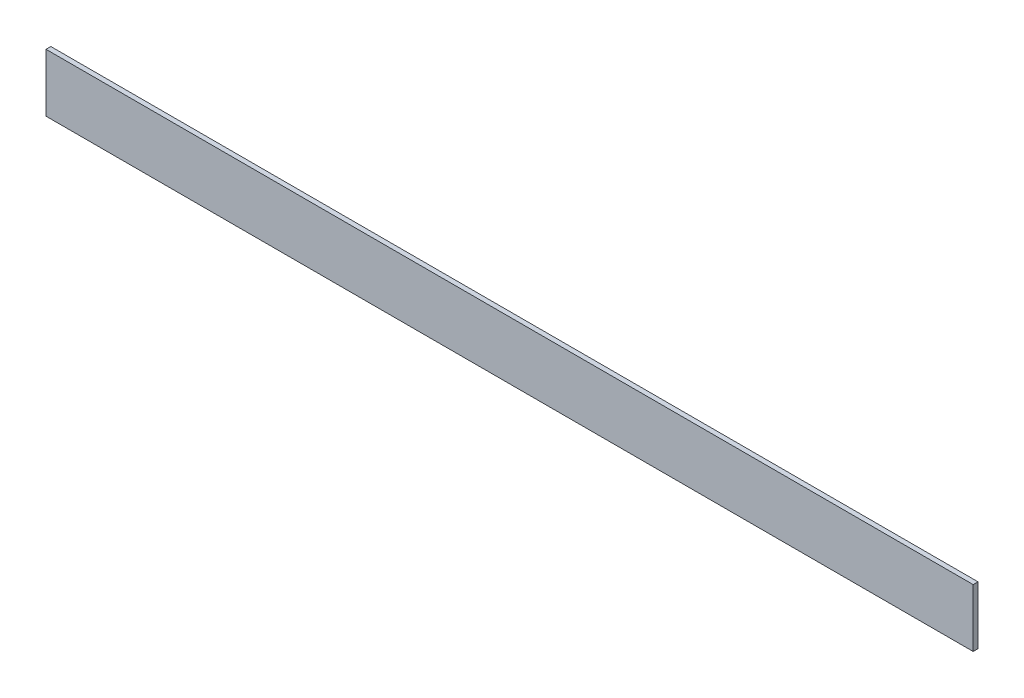
ISO-10303-21;
HEADER;
FILE_DESCRIPTION(('STEP AP214'),'2;1');
FILE_NAME('part.step','',(''),(''),'','','');
FILE_SCHEMA(('AUTOMOTIVE_DESIGN { 1 0 10303 214 1 1 1 1 }'));
ENDSEC;
DATA;
#1=APPLICATION_CONTEXT('core data for automotive mechanical design processes');
#2=APPLICATION_PROTOCOL_DEFINITION('international standard','automotive_design',2000,#1);
#3=PRODUCT_CONTEXT('',#1,'mechanical');
#4=PRODUCT('Part','Part','',(#3));
#5=PRODUCT_RELATED_PRODUCT_CATEGORY('part','',(#4));
#6=PRODUCT_DEFINITION_FORMATION('','',#4);
#7=PRODUCT_DEFINITION_CONTEXT('part definition',#1,'design');
#8=PRODUCT_DEFINITION('design','',#6,#7);
#9=PRODUCT_DEFINITION_SHAPE('','',#8);
#10=(LENGTH_UNIT() NAMED_UNIT(*) SI_UNIT(.MILLI.,.METRE.));
#11=(NAMED_UNIT(*) PLANE_ANGLE_UNIT() SI_UNIT($,.RADIAN.));
#12=(NAMED_UNIT(*) SI_UNIT($,.STERADIAN.) SOLID_ANGLE_UNIT());
#13=UNCERTAINTY_MEASURE_WITH_UNIT(LENGTH_MEASURE(1.E-05),#10,'distance_accuracy_value','');
#14=(GEOMETRIC_REPRESENTATION_CONTEXT(3) GLOBAL_UNCERTAINTY_ASSIGNED_CONTEXT((#13)) GLOBAL_UNIT_ASSIGNED_CONTEXT((#10,
#11,#12)) REPRESENTATION_CONTEXT('',''));
#15=CARTESIAN_POINT('',(0.,0.,0.));
#16=DIRECTION('',(0.,0.,1.));
#17=DIRECTION('',(1.,0.,0.));
#18=AXIS2_PLACEMENT_3D('',#15,#16,#17);
#19=CARTESIAN_POINT('',(480.,-30.,5.));
#20=DIRECTION('',(-1.,0.,0.));
#21=DIRECTION('',(0.,0.,1.));
#22=AXIS2_PLACEMENT_3D('',#19,#20,#21);
#23=PLANE('',#22);
#24=DIRECTION('',(0.,1.,0.));
#25=VECTOR('',#24,1.);
#26=CARTESIAN_POINT('',(480.,-30.,0.));
#27=LINE('',#26,#25);
#28=CARTESIAN_POINT('',(480.,-30.,0.));
#29=VERTEX_POINT('',#28);
#30=CARTESIAN_POINT('',(480.,30.,0.));
#31=VERTEX_POINT('',#30);
#32=EDGE_CURVE('E96',#29,#31,#27,.T.);
#33=ORIENTED_EDGE('',*,*,#32,.T.);
#34=DIRECTION('',(0.,0.,-1.));
#35=VECTOR('',#34,1.);
#36=CARTESIAN_POINT('',(480.,30.,5.));
#37=LINE('',#36,#35);
#38=CARTESIAN_POINT('',(480.,30.,5.));
#39=VERTEX_POINT('',#38);
#40=EDGE_CURVE('E11',#39,#31,#37,.T.);
#41=ORIENTED_EDGE('',*,*,#40,.F.);
#42=DIRECTION('',(0.,1.,0.));
#43=VECTOR('',#42,1.);
#44=CARTESIAN_POINT('',(480.,-30.,5.));
#45=LINE('',#44,#43);
#46=CARTESIAN_POINT('',(480.,-30.,5.));
#47=VERTEX_POINT('',#46);
#48=EDGE_CURVE('E84',#47,#39,#45,.T.);
#49=ORIENTED_EDGE('',*,*,#48,.F.);
#50=DIRECTION('',(0.,0.,-1.));
#51=VECTOR('',#50,1.);
#52=CARTESIAN_POINT('',(480.,-30.,5.));
#53=LINE('',#52,#51);
#54=EDGE_CURVE('E92',#47,#29,#53,.T.);
#55=ORIENTED_EDGE('',*,*,#54,.T.);
#56=EDGE_LOOP('',(#33,#41,#49,#55));
#57=FACE_BOUND('',#56,.T.);
#58=ADVANCED_FACE('F33',(#57),#23,.F.);
#59=CARTESIAN_POINT('',(-480.,30.,5.));
#60=DIRECTION('',(0.,-1.,0.));
#61=DIRECTION('',(0.,0.,-1.));
#62=AXIS2_PLACEMENT_3D('',#59,#60,#61);
#63=PLANE('',#62);
#64=DIRECTION('',(-1.,0.,0.));
#65=VECTOR('',#64,1.);
#66=CARTESIAN_POINT('',(-480.,30.,0.));
#67=LINE('',#66,#65);
#68=CARTESIAN_POINT('',(-480.,30.,0.));
#69=VERTEX_POINT('',#68);
#70=EDGE_CURVE('E88',#31,#69,#67,.T.);
#71=ORIENTED_EDGE('',*,*,#70,.T.);
#72=DIRECTION('',(0.,0.,-1.));
#73=VECTOR('',#72,1.);
#74=CARTESIAN_POINT('',(-480.,30.,5.));
#75=LINE('',#74,#73);
#76=CARTESIAN_POINT('',(-480.,30.,5.));
#77=VERTEX_POINT('',#76);
#78=EDGE_CURVE('E41',#77,#69,#75,.T.);
#79=ORIENTED_EDGE('',*,*,#78,.F.);
#80=DIRECTION('',(-1.,0.,0.));
#81=VECTOR('',#80,1.);
#82=CARTESIAN_POINT('',(-480.,30.,5.));
#83=LINE('',#82,#81);
#84=EDGE_CURVE('E79',#39,#77,#83,.T.);
#85=ORIENTED_EDGE('',*,*,#84,.F.);
#86=ORIENTED_EDGE('',*,*,#40,.T.);
#87=EDGE_LOOP('',(#71,#79,#85,#86));
#88=FACE_BOUND('',#87,.T.);
#89=ADVANCED_FACE('F87',(#88),#63,.F.);
#90=CARTESIAN_POINT('',(-480.,-30.,5.));
#91=DIRECTION('',(1.,0.,0.));
#92=DIRECTION('',(0.,0.,-1.));
#93=AXIS2_PLACEMENT_3D('',#90,#91,#92);
#94=PLANE('',#93);
#95=DIRECTION('',(0.,-1.,0.));
#96=VECTOR('',#95,1.);
#97=CARTESIAN_POINT('',(-480.,-30.,0.));
#98=LINE('',#97,#96);
#99=CARTESIAN_POINT('',(-480.,-30.,0.));
#100=VERTEX_POINT('',#99);
#101=EDGE_CURVE('E66',#69,#100,#98,.T.);
#102=ORIENTED_EDGE('',*,*,#101,.T.);
#103=DIRECTION('',(0.,0.,-1.));
#104=VECTOR('',#103,1.);
#105=CARTESIAN_POINT('',(-480.,-30.,5.));
#106=LINE('',#105,#104);
#107=CARTESIAN_POINT('',(-480.,-30.,5.));
#108=VERTEX_POINT('',#107);
#109=EDGE_CURVE('E89',#108,#100,#106,.T.);
#110=ORIENTED_EDGE('',*,*,#109,.F.);
#111=DIRECTION('',(0.,-1.,0.));
#112=VECTOR('',#111,1.);
#113=CARTESIAN_POINT('',(-480.,-30.,5.));
#114=LINE('',#113,#112);
#115=EDGE_CURVE('E82',#77,#108,#114,.T.);
#116=ORIENTED_EDGE('',*,*,#115,.F.);
#117=ORIENTED_EDGE('',*,*,#78,.T.);
#118=EDGE_LOOP('',(#102,#110,#116,#117));
#119=FACE_BOUND('',#118,.T.);
#120=ADVANCED_FACE('F90',(#119),#94,.F.);
#121=CARTESIAN_POINT('',(-480.,-30.,5.));
#122=DIRECTION('',(0.,1.,0.));
#123=DIRECTION('',(0.,0.,1.));
#124=AXIS2_PLACEMENT_3D('',#121,#122,#123);
#125=PLANE('',#124);
#126=DIRECTION('',(1.,0.,0.));
#127=VECTOR('',#126,1.);
#128=CARTESIAN_POINT('',(-480.,-30.,0.));
#129=LINE('',#128,#127);
#130=EDGE_CURVE('E72',#100,#29,#129,.T.);
#131=ORIENTED_EDGE('',*,*,#130,.T.);
#132=ORIENTED_EDGE('',*,*,#54,.F.);
#133=DIRECTION('',(1.,0.,0.));
#134=VECTOR('',#133,1.);
#135=CARTESIAN_POINT('',(-480.,-30.,5.));
#136=LINE('',#135,#134);
#137=EDGE_CURVE('E49',#108,#47,#136,.T.);
#138=ORIENTED_EDGE('',*,*,#137,.F.);
#139=ORIENTED_EDGE('',*,*,#109,.T.);
#140=EDGE_LOOP('',(#131,#132,#138,#139));
#141=FACE_BOUND('',#140,.T.);
#142=ADVANCED_FACE('F103',(#141),#125,.F.);
#143=CARTESIAN_POINT('',(0.,0.,5.));
#144=DIRECTION('',(0.,0.,-1.));
#145=DIRECTION('',(-1.,0.,0.));
#146=AXIS2_PLACEMENT_3D('',#143,#144,#145);
#147=PLANE('',#146);
#148=ORIENTED_EDGE('',*,*,#48,.T.);
#149=ORIENTED_EDGE('',*,*,#84,.T.);
#150=ORIENTED_EDGE('',*,*,#115,.T.);
#151=ORIENTED_EDGE('',*,*,#137,.T.);
#152=EDGE_LOOP('',(#148,#149,#150,#151));
#153=FACE_BOUND('',#152,.T.);
#154=ADVANCED_FACE('F80',(#153),#147,.F.);
#155=CARTESIAN_POINT('',(0.,0.,0.));
#156=DIRECTION('',(0.,0.,-1.));
#157=DIRECTION('',(-1.,0.,0.));
#158=AXIS2_PLACEMENT_3D('',#155,#156,#157);
#159=PLANE('',#158);
#160=ORIENTED_EDGE('',*,*,#32,.F.);
#161=ORIENTED_EDGE('',*,*,#130,.F.);
#162=ORIENTED_EDGE('',*,*,#101,.F.);
#163=ORIENTED_EDGE('',*,*,#70,.F.);
#164=EDGE_LOOP('',(#160,#161,#162,#163));
#165=FACE_BOUND('',#164,.T.);
#166=ADVANCED_FACE('F106',(#165),#159,.T.);
#167=CLOSED_SHELL('',(#58,#89,#120,#142,#154,#166));
#168=MANIFOLD_SOLID_BREP('B2',#167);
#169=ADVANCED_BREP_SHAPE_REPRESENTATION('',(#18,#168),#14);
#170=SHAPE_DEFINITION_REPRESENTATION(#9,#169);
ENDSEC;
END-ISO-10303-21;
